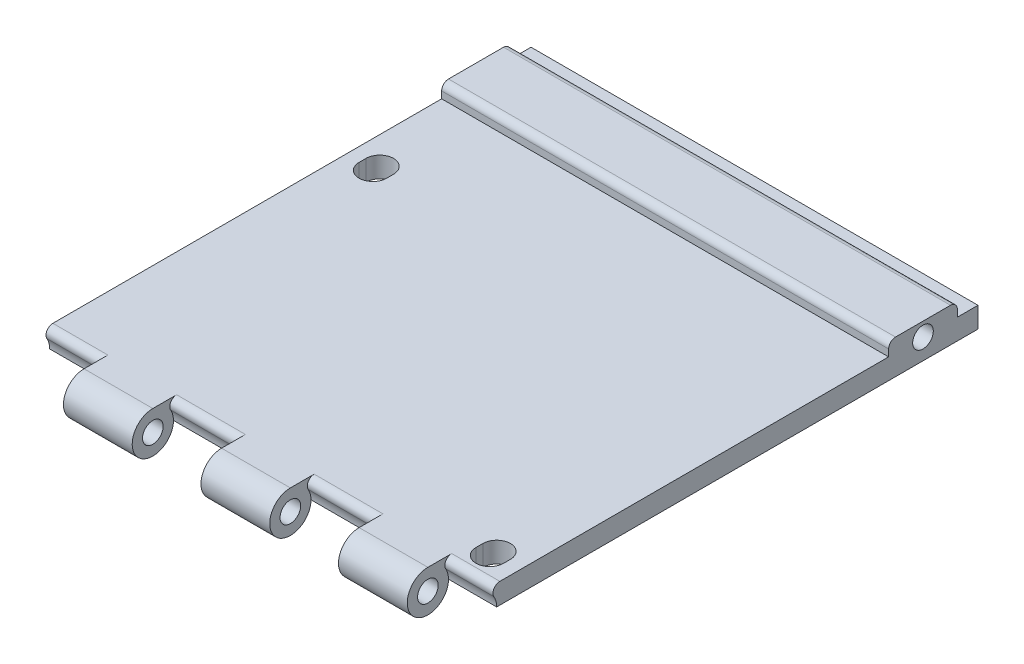
ISO-10303-21;
HEADER;
FILE_DESCRIPTION(('STEP AP214'),'2;1');
FILE_NAME('part.step','',(''),(''),'','','');
FILE_SCHEMA(('AUTOMOTIVE_DESIGN { 1 0 10303 214 1 1 1 1 }'));
ENDSEC;
DATA;
#1=APPLICATION_CONTEXT('core data for automotive mechanical design processes');
#2=APPLICATION_PROTOCOL_DEFINITION('international standard','automotive_design',2000,#1);
#3=PRODUCT_CONTEXT('',#1,'mechanical');
#4=PRODUCT('Part','Part','',(#3));
#5=PRODUCT_RELATED_PRODUCT_CATEGORY('part','',(#4));
#6=PRODUCT_DEFINITION_FORMATION('','',#4);
#7=PRODUCT_DEFINITION_CONTEXT('part definition',#1,'design');
#8=PRODUCT_DEFINITION('design','',#6,#7);
#9=PRODUCT_DEFINITION_SHAPE('','',#8);
#10=(LENGTH_UNIT() NAMED_UNIT(*) SI_UNIT(.MILLI.,.METRE.));
#11=(NAMED_UNIT(*) PLANE_ANGLE_UNIT() SI_UNIT($,.RADIAN.));
#12=(NAMED_UNIT(*) SI_UNIT($,.STERADIAN.) SOLID_ANGLE_UNIT());
#13=UNCERTAINTY_MEASURE_WITH_UNIT(LENGTH_MEASURE(1.E-05),#10,'distance_accuracy_value','');
#14=(GEOMETRIC_REPRESENTATION_CONTEXT(3) GLOBAL_UNCERTAINTY_ASSIGNED_CONTEXT((#13)) GLOBAL_UNIT_ASSIGNED_CONTEXT((#10,
#11,#12)) REPRESENTATION_CONTEXT('',''));
#15=CARTESIAN_POINT('',(0.,0.,0.));
#16=DIRECTION('',(0.,0.,1.));
#17=DIRECTION('',(1.,0.,0.));
#18=AXIS2_PLACEMENT_3D('',#15,#16,#17);
#19=CARTESIAN_POINT('',(0.,3.,0.));
#20=DIRECTION('',(0.,1.,0.));
#21=DIRECTION('',(0.,0.,1.));
#22=AXIS2_PLACEMENT_3D('',#19,#20,#21);
#23=PLANE('',#22);
#24=DIRECTION('',(-1.,0.,0.));
#25=VECTOR('',#24,1.);
#26=CARTESIAN_POINT('',(0.,3.,-33.5));
#27=LINE('',#26,#25);
#28=CARTESIAN_POINT('',(32.5,3.,-33.5));
#29=VERTEX_POINT('',#28);
#30=CARTESIAN_POINT('',(-32.5,3.,-33.5));
#31=VERTEX_POINT('',#30);
#32=EDGE_CURVE('E290',#29,#31,#27,.T.);
#33=ORIENTED_EDGE('',*,*,#32,.F.);
#34=DIRECTION('',(0.,0.,-1.));
#35=VECTOR('',#34,1.);
#36=CARTESIAN_POINT('',(32.5,3.,-36.5));
#37=LINE('',#36,#35);
#38=CARTESIAN_POINT('',(32.5,3.,-36.5));
#39=VERTEX_POINT('',#38);
#40=EDGE_CURVE('E382',#29,#39,#37,.T.);
#41=ORIENTED_EDGE('',*,*,#40,.T.);
#42=DIRECTION('',(-1.,0.,0.));
#43=VECTOR('',#42,1.);
#44=CARTESIAN_POINT('',(-32.5,3.,-36.5));
#45=LINE('',#44,#43);
#46=CARTESIAN_POINT('',(-32.5,3.,-36.5));
#47=VERTEX_POINT('',#46);
#48=EDGE_CURVE('E381',#39,#47,#45,.T.);
#49=ORIENTED_EDGE('',*,*,#48,.T.);
#50=DIRECTION('',(0.,0.,1.));
#51=VECTOR('',#50,1.);
#52=CARTESIAN_POINT('',(-32.5,3.,-36.5));
#53=LINE('',#52,#51);
#54=EDGE_CURVE('E385',#47,#31,#53,.T.);
#55=ORIENTED_EDGE('',*,*,#54,.T.);
#56=EDGE_LOOP('',(#33,#41,#49,#55));
#57=FACE_BOUND('',#56,.T.);
#58=ADVANCED_FACE('F35',(#57),#23,.T.);
#59=CARTESIAN_POINT('',(-32.5,0.,36.5));
#60=DIRECTION('',(1.,0.,0.));
#61=DIRECTION('',(0.,0.,-1.));
#62=AXIS2_PLACEMENT_3D('',#59,#60,#61);
#63=CYLINDRICAL_SURFACE('',#62,3.);
#64=DIRECTION('',(1.,0.,0.));
#65=VECTOR('',#64,1.);
#66=CARTESIAN_POINT('',(-32.5,0.,33.5));
#67=LINE('',#66,#65);
#68=CARTESIAN_POINT('',(25.5,0.,33.5));
#69=VERTEX_POINT('',#68);
#70=CARTESIAN_POINT('',(15.5,0.,33.5));
#71=VERTEX_POINT('',#70);
#72=EDGE_CURVE('E409',#69,#71,#67,.F.);
#73=ORIENTED_EDGE('',*,*,#72,.F.);
#74=CARTESIAN_POINT('',(25.5,0.,36.5));
#75=DIRECTION('',(1.,0.,0.));
#76=DIRECTION('',(0.,0.,-1.));
#77=AXIS2_PLACEMENT_3D('',#74,#75,#76);
#78=CIRCLE('',#77,3.);
#79=CARTESIAN_POINT('',(25.5,3.,36.5));
#80=VERTEX_POINT('',#79);
#81=EDGE_CURVE('E359',#80,#69,#78,.T.);
#82=ORIENTED_EDGE('',*,*,#81,.F.);
#83=DIRECTION('',(1.,0.,0.));
#84=VECTOR('',#83,1.);
#85=CARTESIAN_POINT('',(-32.5,3.,36.5));
#86=LINE('',#85,#84);
#87=CARTESIAN_POINT('',(15.5,3.,36.5));
#88=VERTEX_POINT('',#87);
#89=EDGE_CURVE('E388',#88,#80,#86,.T.);
#90=ORIENTED_EDGE('',*,*,#89,.F.);
#91=CARTESIAN_POINT('',(15.5,0.,36.5));
#92=DIRECTION('',(-1.,0.,0.));
#93=DIRECTION('',(0.,0.,1.));
#94=AXIS2_PLACEMENT_3D('',#91,#92,#93);
#95=CIRCLE('',#94,2.99999999999999);
#96=EDGE_CURVE('E358',#71,#88,#95,.T.);
#97=ORIENTED_EDGE('',*,*,#96,.F.);
#98=EDGE_LOOP('',(#73,#82,#90,#97));
#99=FACE_BOUND('',#98,.T.);
#100=ADVANCED_FACE('F574',(#99),#63,.T.);
#101=CARTESIAN_POINT('',(5.5,0.,36.5));
#102=DIRECTION('',(-1.,0.,0.));
#103=DIRECTION('',(0.,0.,1.));
#104=AXIS2_PLACEMENT_3D('',#101,#102,#103);
#105=CIRCLE('',#104,2.99999999999999);
#106=CARTESIAN_POINT('',(5.50000000000001,0.,33.5));
#107=VERTEX_POINT('',#106);
#108=CARTESIAN_POINT('',(5.5,3.,36.5));
#109=VERTEX_POINT('',#108);
#110=EDGE_CURVE('E365',#107,#109,#105,.T.);
#111=ORIENTED_EDGE('',*,*,#110,.T.);
#112=CARTESIAN_POINT('',(-4.5,3.,36.5));
#113=VERTEX_POINT('',#112);
#114=EDGE_CURVE('E391',#113,#109,#86,.T.);
#115=ORIENTED_EDGE('',*,*,#114,.F.);
#116=CARTESIAN_POINT('',(-4.5,0.,36.5));
#117=DIRECTION('',(-1.,0.,0.));
#118=DIRECTION('',(0.,0.,1.));
#119=AXIS2_PLACEMENT_3D('',#116,#117,#118);
#120=CIRCLE('',#119,2.99999999999999);
#121=CARTESIAN_POINT('',(-4.5,0.,33.5));
#122=VERTEX_POINT('',#121);
#123=EDGE_CURVE('E364',#122,#113,#120,.T.);
#124=ORIENTED_EDGE('',*,*,#123,.F.);
#125=EDGE_CURVE('E520',#107,#122,#67,.F.);
#126=ORIENTED_EDGE('',*,*,#125,.F.);
#127=EDGE_LOOP('',(#111,#115,#124,#126));
#128=FACE_BOUND('',#127,.T.);
#129=ADVANCED_FACE('F585',(#128),#63,.T.);
#130=CARTESIAN_POINT('',(-14.5,0.,36.5));
#131=DIRECTION('',(-1.,0.,0.));
#132=DIRECTION('',(0.,0.,1.));
#133=AXIS2_PLACEMENT_3D('',#130,#131,#132);
#134=CIRCLE('',#133,2.99999999999999);
#135=CARTESIAN_POINT('',(-14.5,0.,33.5));
#136=VERTEX_POINT('',#135);
#137=CARTESIAN_POINT('',(-14.5,3.,36.5));
#138=VERTEX_POINT('',#137);
#139=EDGE_CURVE('E371',#136,#138,#134,.T.);
#140=ORIENTED_EDGE('',*,*,#139,.T.);
#141=CARTESIAN_POINT('',(-24.5,2.99999999999999,36.5));
#142=VERTEX_POINT('',#141);
#143=EDGE_CURVE('E392',#142,#138,#86,.T.);
#144=ORIENTED_EDGE('',*,*,#143,.F.);
#145=CARTESIAN_POINT('',(-24.5,0.,36.5));
#146=DIRECTION('',(-1.,0.,0.));
#147=DIRECTION('',(0.,0.,1.));
#148=AXIS2_PLACEMENT_3D('',#145,#146,#147);
#149=CIRCLE('',#148,3.);
#150=CARTESIAN_POINT('',(-24.5,0.,33.5));
#151=VERTEX_POINT('',#150);
#152=EDGE_CURVE('E408',#142,#151,#149,.F.);
#153=ORIENTED_EDGE('',*,*,#152,.T.);
#154=EDGE_CURVE('E511',#136,#151,#67,.F.);
#155=ORIENTED_EDGE('',*,*,#154,.F.);
#156=EDGE_LOOP('',(#140,#144,#153,#155));
#157=FACE_BOUND('',#156,.T.);
#158=ADVANCED_FACE('F509',(#157),#63,.T.);
#159=CARTESIAN_POINT('',(32.5,3.,-36.5));
#160=DIRECTION('',(-1.,0.,0.));
#161=DIRECTION('',(0.,0.,1.));
#162=AXIS2_PLACEMENT_3D('',#159,#160,#161);
#163=PLANE('',#162);
#164=DIRECTION('',(0.,0.,-1.));
#165=VECTOR('',#164,1.);
#166=CARTESIAN_POINT('',(32.5,5.,-32.5));
#167=LINE('',#166,#165);
#168=CARTESIAN_POINT('',(32.5,5.,-24.5));
#169=VERTEX_POINT('',#168);
#170=CARTESIAN_POINT('',(32.5,5.,-32.5));
#171=VERTEX_POINT('',#170);
#172=EDGE_CURVE('E264',#169,#171,#167,.T.);
#173=ORIENTED_EDGE('',*,*,#172,.F.);
#174=CARTESIAN_POINT('',(32.5,4.,-24.5));
#175=DIRECTION('',(-1.,0.,0.));
#176=DIRECTION('',(0.,0.,-1.));
#177=AXIS2_PLACEMENT_3D('',#174,#175,#176);
#178=CIRCLE('',#177,1.);
#179=CARTESIAN_POINT('',(32.5,3.99999999999999,-23.5));
#180=VERTEX_POINT('',#179);
#181=EDGE_CURVE('E250',#180,#169,#178,.T.);
#182=ORIENTED_EDGE('',*,*,#181,.F.);
#183=DIRECTION('',(0.,1.,0.));
#184=VECTOR('',#183,1.);
#185=CARTESIAN_POINT('',(32.5,0.,-23.5));
#186=LINE('',#185,#184);
#187=CARTESIAN_POINT('',(32.5,3.,-23.5));
#188=VERTEX_POINT('',#187);
#189=EDGE_CURVE('E239',#188,#180,#186,.T.);
#190=ORIENTED_EDGE('',*,*,#189,.F.);
#191=CARTESIAN_POINT('',(32.5,3.,33.0358983848623));
#192=VERTEX_POINT('',#191);
#193=EDGE_CURVE('E379',#192,#188,#37,.T.);
#194=ORIENTED_EDGE('',*,*,#193,.F.);
#195=CARTESIAN_POINT('',(32.5,2.,33.0358983848623));
#196=DIRECTION('',(-1.,0.,0.));
#197=DIRECTION('',(0.,0.,1.));
#198=AXIS2_PLACEMENT_3D('',#195,#196,#197);
#199=CIRCLE('',#198,1.);
#200=CARTESIAN_POINT('',(32.5,1.5,33.9019237886467));
#201=VERTEX_POINT('',#200);
#202=EDGE_CURVE('E460',#192,#201,#199,.F.);
#203=ORIENTED_EDGE('',*,*,#202,.T.);
#204=CARTESIAN_POINT('',(32.5,0.,36.5));
#205=DIRECTION('',(1.,0.,0.));
#206=DIRECTION('',(0.,0.,-1.));
#207=AXIS2_PLACEMENT_3D('',#204,#205,#206);
#208=CIRCLE('',#207,3.);
#209=CARTESIAN_POINT('',(32.5,0.,33.5));
#210=VERTEX_POINT('',#209);
#211=EDGE_CURVE('E330',#210,#201,#208,.T.);
#212=ORIENTED_EDGE('',*,*,#211,.F.);
#213=DIRECTION('',(0.,0.,-1.));
#214=VECTOR('',#213,1.);
#215=CARTESIAN_POINT('',(32.5,0.,-36.5));
#216=LINE('',#215,#214);
#217=CARTESIAN_POINT('',(32.5,0.,-36.5));
#218=VERTEX_POINT('',#217);
#219=EDGE_CURVE('E377',#210,#218,#216,.T.);
#220=ORIENTED_EDGE('',*,*,#219,.T.);
#221=DIRECTION('',(0.,-1.,0.));
#222=VECTOR('',#221,1.);
#223=CARTESIAN_POINT('',(32.5,3.,-36.5));
#224=LINE('',#223,#222);
#225=EDGE_CURVE('E401',#39,#218,#224,.T.);
#226=ORIENTED_EDGE('',*,*,#225,.F.);
#227=ORIENTED_EDGE('',*,*,#40,.F.);
#228=DIRECTION('',(0.,-1.,0.));
#229=VECTOR('',#228,1.);
#230=CARTESIAN_POINT('',(32.5,0.,-33.5));
#231=LINE('',#230,#229);
#232=CARTESIAN_POINT('',(32.5,3.99999999999999,-33.5));
#233=VERTEX_POINT('',#232);
#234=EDGE_CURVE('E251',#233,#29,#231,.T.);
#235=ORIENTED_EDGE('',*,*,#234,.F.);
#236=CARTESIAN_POINT('',(32.5,4.,-32.5));
#237=DIRECTION('',(-1.,0.,0.));
#238=DIRECTION('',(0.,0.,-1.));
#239=AXIS2_PLACEMENT_3D('',#236,#237,#238);
#240=CIRCLE('',#239,1.);
#241=EDGE_CURVE('E259',#171,#233,#240,.T.);
#242=ORIENTED_EDGE('',*,*,#241,.F.);
#243=EDGE_LOOP('',(#173,#182,#190,#194,#203,#212,#220,#226,#227,#235,#242));
#244=FACE_BOUND('',#243,.T.);
#245=CARTESIAN_POINT('',(32.5,3.,-28.5));
#246=DIRECTION('',(-1.,0.,0.));
#247=DIRECTION('',(0.,0.,1.));
#248=AXIS2_PLACEMENT_3D('',#245,#246,#247);
#249=CIRCLE('',#248,1.5);
#250=CARTESIAN_POINT('',(32.5,3.,-27.));
#251=VERTEX_POINT('',#250);
#252=EDGE_CURVE('E293',#251,#251,#249,.T.);
#253=ORIENTED_EDGE('',*,*,#252,.T.);
#254=EDGE_LOOP('',(#253));
#255=FACE_BOUND('',#254,.T.);
#256=ADVANCED_FACE('F261',(#244,#255),#163,.F.);
#257=CARTESIAN_POINT('',(-32.5,3.,-36.5));
#258=DIRECTION('',(0.,0.,1.));
#259=DIRECTION('',(1.,0.,0.));
#260=AXIS2_PLACEMENT_3D('',#257,#258,#259);
#261=PLANE('',#260);
#262=DIRECTION('',(-1.,0.,0.));
#263=VECTOR('',#262,1.);
#264=CARTESIAN_POINT('',(-32.5,0.,-36.5));
#265=LINE('',#264,#263);
#266=CARTESIAN_POINT('',(-32.5,0.,-36.5));
#267=VERTEX_POINT('',#266);
#268=EDGE_CURVE('E394',#218,#267,#265,.T.);
#269=ORIENTED_EDGE('',*,*,#268,.T.);
#270=DIRECTION('',(0.,-1.,0.));
#271=VECTOR('',#270,1.);
#272=CARTESIAN_POINT('',(-32.5,3.,-36.5));
#273=LINE('',#272,#271);
#274=EDGE_CURVE('E398',#47,#267,#273,.T.);
#275=ORIENTED_EDGE('',*,*,#274,.F.);
#276=ORIENTED_EDGE('',*,*,#48,.F.);
#277=ORIENTED_EDGE('',*,*,#225,.T.);
#278=EDGE_LOOP('',(#269,#275,#276,#277));
#279=FACE_BOUND('',#278,.T.);
#280=ADVANCED_FACE('F554',(#279),#261,.F.);
#281=CARTESIAN_POINT('',(-32.5,3.,-36.5));
#282=DIRECTION('',(1.,0.,0.));
#283=DIRECTION('',(0.,0.,-1.));
#284=AXIS2_PLACEMENT_3D('',#281,#282,#283);
#285=PLANE('',#284);
#286=DIRECTION('',(0.,0.,-1.));
#287=VECTOR('',#286,1.);
#288=CARTESIAN_POINT('',(-32.5,5.,-32.5));
#289=LINE('',#288,#287);
#290=CARTESIAN_POINT('',(-32.5,5.,-24.5));
#291=VERTEX_POINT('',#290);
#292=CARTESIAN_POINT('',(-32.5,5.,-32.5));
#293=VERTEX_POINT('',#292);
#294=EDGE_CURVE('E278',#291,#293,#289,.T.);
#295=ORIENTED_EDGE('',*,*,#294,.T.);
#296=CARTESIAN_POINT('',(-32.5,4.,-32.5));
#297=DIRECTION('',(-1.,0.,0.));
#298=DIRECTION('',(0.,0.,-1.));
#299=AXIS2_PLACEMENT_3D('',#296,#297,#298);
#300=CIRCLE('',#299,1.);
#301=CARTESIAN_POINT('',(-32.5,3.99999999999999,-33.5));
#302=VERTEX_POINT('',#301);
#303=EDGE_CURVE('E280',#293,#302,#300,.T.);
#304=ORIENTED_EDGE('',*,*,#303,.T.);
#305=DIRECTION('',(0.,-1.,0.));
#306=VECTOR('',#305,1.);
#307=CARTESIAN_POINT('',(-32.5,0.,-33.5));
#308=LINE('',#307,#306);
#309=EDGE_CURVE('E272',#302,#31,#308,.T.);
#310=ORIENTED_EDGE('',*,*,#309,.T.);
#311=ORIENTED_EDGE('',*,*,#54,.F.);
#312=ORIENTED_EDGE('',*,*,#274,.T.);
#313=DIRECTION('',(0.,0.,1.));
#314=VECTOR('',#313,1.);
#315=CARTESIAN_POINT('',(-32.5,0.,-36.5));
#316=LINE('',#315,#314);
#317=CARTESIAN_POINT('',(-32.5,0.,33.5));
#318=VERTEX_POINT('',#317);
#319=EDGE_CURVE('E396',#267,#318,#316,.T.);
#320=ORIENTED_EDGE('',*,*,#319,.T.);
#321=CARTESIAN_POINT('',(-32.5,0.,36.5));
#322=DIRECTION('',(-1.,0.,0.));
#323=DIRECTION('',(0.,0.,1.));
#324=AXIS2_PLACEMENT_3D('',#321,#322,#323);
#325=CIRCLE('',#324,2.99999999999999);
#326=CARTESIAN_POINT('',(-32.5,1.5,33.9019237886467));
#327=VERTEX_POINT('',#326);
#328=EDGE_CURVE('E374',#327,#318,#325,.T.);
#329=ORIENTED_EDGE('',*,*,#328,.F.);
#330=CARTESIAN_POINT('',(-32.5,2.,33.0358983848623));
#331=DIRECTION('',(1.,0.,0.));
#332=DIRECTION('',(0.,0.,-1.));
#333=AXIS2_PLACEMENT_3D('',#330,#331,#332);
#334=CIRCLE('',#333,1.);
#335=CARTESIAN_POINT('',(-32.5,3.,33.0358983848623));
#336=VERTEX_POINT('',#335);
#337=EDGE_CURVE('E472',#327,#336,#334,.F.);
#338=ORIENTED_EDGE('',*,*,#337,.T.);
#339=CARTESIAN_POINT('',(-32.5,3.,-23.5));
#340=VERTEX_POINT('',#339);
#341=EDGE_CURVE('E384',#340,#336,#53,.T.);
#342=ORIENTED_EDGE('',*,*,#341,.F.);
#343=DIRECTION('',(0.,1.,0.));
#344=VECTOR('',#343,1.);
#345=CARTESIAN_POINT('',(-32.5,0.,-23.5));
#346=LINE('',#345,#344);
#347=CARTESIAN_POINT('',(-32.5,3.99999999999999,-23.5));
#348=VERTEX_POINT('',#347);
#349=EDGE_CURVE('E275',#340,#348,#346,.T.);
#350=ORIENTED_EDGE('',*,*,#349,.T.);
#351=CARTESIAN_POINT('',(-32.5,4.,-24.5));
#352=DIRECTION('',(-1.,0.,0.));
#353=DIRECTION('',(0.,0.,-1.));
#354=AXIS2_PLACEMENT_3D('',#351,#352,#353);
#355=CIRCLE('',#354,1.);
#356=EDGE_CURVE('E257',#348,#291,#355,.T.);
#357=ORIENTED_EDGE('',*,*,#356,.T.);
#358=EDGE_LOOP('',(#295,#304,#310,#311,#312,#320,#329,#338,#342,#350,#357));
#359=FACE_BOUND('',#358,.T.);
#360=CARTESIAN_POINT('',(-32.5,3.,-28.5));
#361=DIRECTION('',(-1.,0.,0.));
#362=DIRECTION('',(0.,0.,1.));
#363=AXIS2_PLACEMENT_3D('',#360,#361,#362);
#364=CIRCLE('',#363,1.5);
#365=CARTESIAN_POINT('',(-32.5,3.,-27.));
#366=VERTEX_POINT('',#365);
#367=EDGE_CURVE('E292',#366,#366,#364,.T.);
#368=ORIENTED_EDGE('',*,*,#367,.F.);
#369=EDGE_LOOP('',(#368));
#370=FACE_BOUND('',#369,.T.);
#371=ADVANCED_FACE('F530',(#359,#370),#285,.F.);
#372=DIRECTION('',(1.,0.,0.));
#373=VECTOR('',#372,1.);
#374=CARTESIAN_POINT('',(0.,3.,-23.5));
#375=LINE('',#374,#373);
#376=EDGE_CURVE('E245',#340,#188,#375,.T.);
#377=ORIENTED_EDGE('',*,*,#376,.F.);
#378=ORIENTED_EDGE('',*,*,#341,.T.);
#379=DIRECTION('',(1.,0.,0.));
#380=VECTOR('',#379,1.);
#381=CARTESIAN_POINT('',(0.,3.,33.0358983848623));
#382=LINE('',#381,#380);
#383=CARTESIAN_POINT('',(-24.5,3.,33.0358983848623));
#384=VERTEX_POINT('',#383);
#385=EDGE_CURVE('E439',#336,#384,#382,.T.);
#386=ORIENTED_EDGE('',*,*,#385,.T.);
#387=DIRECTION('',(0.,0.,1.));
#388=VECTOR('',#387,1.);
#389=CARTESIAN_POINT('',(-24.5,3.,0.));
#390=LINE('',#389,#388);
#391=EDGE_CURVE('E435',#384,#142,#390,.T.);
#392=ORIENTED_EDGE('',*,*,#391,.T.);
#393=ORIENTED_EDGE('',*,*,#143,.T.);
#394=DIRECTION('',(0.,0.,-1.));
#395=VECTOR('',#394,1.);
#396=CARTESIAN_POINT('',(-14.5,3.,36.5));
#397=LINE('',#396,#395);
#398=CARTESIAN_POINT('',(-14.5,3.,33.0358983848623));
#399=VERTEX_POINT('',#398);
#400=EDGE_CURVE('E50',#138,#399,#397,.T.);
#401=ORIENTED_EDGE('',*,*,#400,.T.);
#402=DIRECTION('',(1.,0.,0.));
#403=VECTOR('',#402,1.);
#404=CARTESIAN_POINT('',(0.,3.,33.0358983848623));
#405=LINE('',#404,#403);
#406=CARTESIAN_POINT('',(-4.5,3.,33.0358983848623));
#407=VERTEX_POINT('',#406);
#408=EDGE_CURVE('E444',#399,#407,#405,.T.);
#409=ORIENTED_EDGE('',*,*,#408,.T.);
#410=DIRECTION('',(0.,0.,1.));
#411=VECTOR('',#410,1.);
#412=CARTESIAN_POINT('',(-4.5,3.,0.));
#413=LINE('',#412,#411);
#414=EDGE_CURVE('E442',#407,#113,#413,.T.);
#415=ORIENTED_EDGE('',*,*,#414,.T.);
#416=ORIENTED_EDGE('',*,*,#114,.T.);
#417=DIRECTION('',(0.,0.,-1.));
#418=VECTOR('',#417,1.);
#419=CARTESIAN_POINT('',(5.5,3.,36.5));
#420=LINE('',#419,#418);
#421=CARTESIAN_POINT('',(5.5,3.,33.0358983848623));
#422=VERTEX_POINT('',#421);
#423=EDGE_CURVE('E58',#109,#422,#420,.T.);
#424=ORIENTED_EDGE('',*,*,#423,.T.);
#425=DIRECTION('',(1.,0.,0.));
#426=VECTOR('',#425,1.);
#427=CARTESIAN_POINT('',(0.,3.,33.0358983848623));
#428=LINE('',#427,#426);
#429=CARTESIAN_POINT('',(15.5,3.,33.0358983848623));
#430=VERTEX_POINT('',#429);
#431=EDGE_CURVE('E450',#422,#430,#428,.T.);
#432=ORIENTED_EDGE('',*,*,#431,.T.);
#433=DIRECTION('',(0.,0.,1.));
#434=VECTOR('',#433,1.);
#435=CARTESIAN_POINT('',(15.5,3.,0.));
#436=LINE('',#435,#434);
#437=EDGE_CURVE('E448',#430,#88,#436,.T.);
#438=ORIENTED_EDGE('',*,*,#437,.T.);
#439=ORIENTED_EDGE('',*,*,#89,.T.);
#440=DIRECTION('',(0.,0.,-1.));
#441=VECTOR('',#440,1.);
#442=CARTESIAN_POINT('',(25.5,3.,0.));
#443=LINE('',#442,#441);
#444=CARTESIAN_POINT('',(25.5,3.,33.0358983848623));
#445=VERTEX_POINT('',#444);
#446=EDGE_CURVE('E454',#80,#445,#443,.T.);
#447=ORIENTED_EDGE('',*,*,#446,.T.);
#448=DIRECTION('',(-1.,0.,0.));
#449=VECTOR('',#448,1.);
#450=CARTESIAN_POINT('',(32.5,3.,33.0358983848623));
#451=LINE('',#450,#449);
#452=EDGE_CURVE('E457',#445,#192,#451,.F.);
#453=ORIENTED_EDGE('',*,*,#452,.T.);
#454=ORIENTED_EDGE('',*,*,#193,.T.);
#455=EDGE_LOOP('',(#377,#378,#386,#392,#393,#401,#409,#415,#416,#424,#432,#438,#439,#447,#453,#454));
#456=FACE_BOUND('',#455,.T.);
#457=DIRECTION('',(0.,0.,1.));
#458=VECTOR('',#457,1.);
#459=CARTESIAN_POINT('',(-30.5,3.,0.));
#460=LINE('',#459,#458);
#461=CARTESIAN_POINT('',(-30.5,3.,-10.5));
#462=VERTEX_POINT('',#461);
#463=CARTESIAN_POINT('',(-30.5,3.,-9.5));
#464=VERTEX_POINT('',#463);
#465=EDGE_CURVE('E315',#462,#464,#460,.T.);
#466=ORIENTED_EDGE('',*,*,#465,.F.);
#467=CARTESIAN_POINT('',(-28.5,3.,-10.5));
#468=DIRECTION('',(0.,1.,0.));
#469=DIRECTION('',(0.,0.,1.));
#470=AXIS2_PLACEMENT_3D('',#467,#468,#469);
#471=CIRCLE('',#470,2.);
#472=CARTESIAN_POINT('',(-26.5,3.,-10.5));
#473=VERTEX_POINT('',#472);
#474=EDGE_CURVE('E324',#473,#462,#471,.T.);
#475=ORIENTED_EDGE('',*,*,#474,.F.);
#476=DIRECTION('',(0.,0.,1.));
#477=VECTOR('',#476,1.);
#478=CARTESIAN_POINT('',(-26.5,3.,0.));
#479=LINE('',#478,#477);
#480=CARTESIAN_POINT('',(-26.5,3.,-9.5));
#481=VERTEX_POINT('',#480);
#482=EDGE_CURVE('E321',#473,#481,#479,.T.);
#483=ORIENTED_EDGE('',*,*,#482,.T.);
#484=CARTESIAN_POINT('',(-28.5,3.,-9.5));
#485=DIRECTION('',(0.,1.,0.));
#486=DIRECTION('',(0.,0.,1.));
#487=AXIS2_PLACEMENT_3D('',#484,#485,#486);
#488=CIRCLE('',#487,2.);
#489=EDGE_CURVE('E317',#464,#481,#488,.T.);
#490=ORIENTED_EDGE('',*,*,#489,.F.);
#491=EDGE_LOOP('',(#466,#475,#483,#490));
#492=FACE_BOUND('',#491,.T.);
#493=CARTESIAN_POINT('',(28.5,3.,29.5));
#494=DIRECTION('',(0.,1.,0.));
#495=DIRECTION('',(0.,0.,1.));
#496=AXIS2_PLACEMENT_3D('',#493,#494,#495);
#497=CIRCLE('',#496,1.99999999999999);
#498=CARTESIAN_POINT('',(30.5,3.,29.5));
#499=VERTEX_POINT('',#498);
#500=CARTESIAN_POINT('',(26.5,3.,29.5));
#501=VERTEX_POINT('',#500);
#502=EDGE_CURVE('E318',#499,#501,#497,.T.);
#503=ORIENTED_EDGE('',*,*,#502,.F.);
#504=DIRECTION('',(0.,0.,1.));
#505=VECTOR('',#504,1.);
#506=CARTESIAN_POINT('',(30.5,3.,29.5));
#507=LINE('',#506,#505);
#508=CARTESIAN_POINT('',(30.5,3.,30.5));
#509=VERTEX_POINT('',#508);
#510=EDGE_CURVE('E340',#499,#509,#507,.T.);
#511=ORIENTED_EDGE('',*,*,#510,.T.);
#512=CARTESIAN_POINT('',(28.5,3.,30.5));
#513=DIRECTION('',(0.,1.,0.));
#514=DIRECTION('',(0.,0.,1.));
#515=AXIS2_PLACEMENT_3D('',#512,#513,#514);
#516=CIRCLE('',#515,1.99999999999999);
#517=CARTESIAN_POINT('',(26.5,3.,30.5));
#518=VERTEX_POINT('',#517);
#519=EDGE_CURVE('E348',#518,#509,#516,.T.);
#520=ORIENTED_EDGE('',*,*,#519,.F.);
#521=DIRECTION('',(0.,0.,1.));
#522=VECTOR('',#521,1.);
#523=CARTESIAN_POINT('',(26.5,3.,29.5));
#524=LINE('',#523,#522);
#525=EDGE_CURVE('E351',#501,#518,#524,.T.);
#526=ORIENTED_EDGE('',*,*,#525,.F.);
#527=EDGE_LOOP('',(#503,#511,#520,#526));
#528=FACE_BOUND('',#527,.T.);
#529=ADVANCED_FACE('F501',(#456,#492,#528),#23,.T.);
#530=CARTESIAN_POINT('',(0.,0.,0.));
#531=DIRECTION('',(0.,1.,0.));
#532=DIRECTION('',(0.,0.,1.));
#533=AXIS2_PLACEMENT_3D('',#530,#531,#532);
#534=PLANE('',#533);
#535=EDGE_CURVE('E404',#151,#318,#67,.F.);
#536=ORIENTED_EDGE('',*,*,#535,.T.);
#537=ORIENTED_EDGE('',*,*,#319,.F.);
#538=ORIENTED_EDGE('',*,*,#268,.F.);
#539=ORIENTED_EDGE('',*,*,#219,.F.);
#540=EDGE_CURVE('E405',#210,#69,#67,.F.);
#541=ORIENTED_EDGE('',*,*,#540,.T.);
#542=ORIENTED_EDGE('',*,*,#72,.T.);
#543=EDGE_CURVE('E515',#71,#107,#67,.F.);
#544=ORIENTED_EDGE('',*,*,#543,.T.);
#545=ORIENTED_EDGE('',*,*,#125,.T.);
#546=EDGE_CURVE('E496',#122,#136,#67,.F.);
#547=ORIENTED_EDGE('',*,*,#546,.T.);
#548=ORIENTED_EDGE('',*,*,#154,.T.);
#549=EDGE_LOOP('',(#536,#537,#538,#539,#541,#542,#544,#545,#547,#548));
#550=FACE_BOUND('',#549,.T.);
#551=DIRECTION('',(0.,0.,1.));
#552=VECTOR('',#551,1.);
#553=CARTESIAN_POINT('',(30.5,0.,0.));
#554=LINE('',#553,#552);
#555=CARTESIAN_POINT('',(30.5,0.,29.5));
#556=VERTEX_POINT('',#555);
#557=CARTESIAN_POINT('',(30.5,0.,30.5));
#558=VERTEX_POINT('',#557);
#559=EDGE_CURVE('E418',#556,#558,#554,.T.);
#560=ORIENTED_EDGE('',*,*,#559,.F.);
#561=CARTESIAN_POINT('',(28.5,0.,29.5));
#562=DIRECTION('',(0.,1.,0.));
#563=DIRECTION('',(0.,0.,1.));
#564=AXIS2_PLACEMENT_3D('',#561,#562,#563);
#565=CIRCLE('',#564,1.99999999999999);
#566=CARTESIAN_POINT('',(26.5,0.,29.5));
#567=VERTEX_POINT('',#566);
#568=EDGE_CURVE('E420',#556,#567,#565,.T.);
#569=ORIENTED_EDGE('',*,*,#568,.T.);
#570=DIRECTION('',(0.,0.,1.));
#571=VECTOR('',#570,1.);
#572=CARTESIAN_POINT('',(26.5,0.,0.));
#573=LINE('',#572,#571);
#574=CARTESIAN_POINT('',(26.5,0.,30.5));
#575=VERTEX_POINT('',#574);
#576=EDGE_CURVE('E412',#567,#575,#573,.T.);
#577=ORIENTED_EDGE('',*,*,#576,.T.);
#578=CARTESIAN_POINT('',(28.5,0.,30.5));
#579=DIRECTION('',(0.,1.,0.));
#580=DIRECTION('',(0.,0.,1.));
#581=AXIS2_PLACEMENT_3D('',#578,#579,#580);
#582=CIRCLE('',#581,1.99999999999999);
#583=EDGE_CURVE('E415',#575,#558,#582,.T.);
#584=ORIENTED_EDGE('',*,*,#583,.T.);
#585=EDGE_LOOP('',(#560,#569,#577,#584));
#586=FACE_BOUND('',#585,.T.);
#587=CARTESIAN_POINT('',(-28.5,0.,-10.5));
#588=DIRECTION('',(0.,1.,0.));
#589=DIRECTION('',(0.,0.,1.));
#590=AXIS2_PLACEMENT_3D('',#587,#588,#589);
#591=CIRCLE('',#590,2.);
#592=CARTESIAN_POINT('',(-26.5,0.,-10.5));
#593=VERTEX_POINT('',#592);
#594=CARTESIAN_POINT('',(-30.5,0.,-10.5));
#595=VERTEX_POINT('',#594);
#596=EDGE_CURVE('E429',#593,#595,#591,.T.);
#597=ORIENTED_EDGE('',*,*,#596,.T.);
#598=DIRECTION('',(0.,0.,1.));
#599=VECTOR('',#598,1.);
#600=CARTESIAN_POINT('',(-30.5,0.,0.));
#601=LINE('',#600,#599);
#602=CARTESIAN_POINT('',(-30.5,0.,-9.5));
#603=VERTEX_POINT('',#602);
#604=EDGE_CURVE('E432',#595,#603,#601,.T.);
#605=ORIENTED_EDGE('',*,*,#604,.T.);
#606=CARTESIAN_POINT('',(-28.5,0.,-9.5));
#607=DIRECTION('',(0.,1.,0.));
#608=DIRECTION('',(0.,0.,1.));
#609=AXIS2_PLACEMENT_3D('',#606,#607,#608);
#610=CIRCLE('',#609,2.);
#611=CARTESIAN_POINT('',(-26.5,0.,-9.5));
#612=VERTEX_POINT('',#611);
#613=EDGE_CURVE('E423',#603,#612,#610,.T.);
#614=ORIENTED_EDGE('',*,*,#613,.T.);
#615=DIRECTION('',(0.,0.,1.));
#616=VECTOR('',#615,1.);
#617=CARTESIAN_POINT('',(-26.5,0.,0.));
#618=LINE('',#617,#616);
#619=EDGE_CURVE('E426',#593,#612,#618,.T.);
#620=ORIENTED_EDGE('',*,*,#619,.F.);
#621=EDGE_LOOP('',(#597,#605,#614,#620));
#622=FACE_BOUND('',#621,.T.);
#623=ADVANCED_FACE('F516',(#550,#586,#622),#534,.F.);
#624=CARTESIAN_POINT('',(-32.5,0.,36.5));
#625=DIRECTION('',(1.,0.,0.));
#626=DIRECTION('',(0.,0.,-1.));
#627=AXIS2_PLACEMENT_3D('',#624,#625,#626);
#628=CYLINDRICAL_SURFACE('',#627,2.99999999999999);
#629=CARTESIAN_POINT('',(-24.5,0.,36.5));
#630=DIRECTION('',(-1.,0.,0.));
#631=DIRECTION('',(0.,0.,1.));
#632=AXIS2_PLACEMENT_3D('',#629,#630,#631);
#633=CIRCLE('',#632,2.99999999999999);
#634=CARTESIAN_POINT('',(-24.5,1.5,33.9019237886467));
#635=VERTEX_POINT('',#634);
#636=EDGE_CURVE('E370',#635,#151,#633,.T.);
#637=ORIENTED_EDGE('',*,*,#636,.F.);
#638=DIRECTION('',(1.,0.,0.));
#639=VECTOR('',#638,1.);
#640=CARTESIAN_POINT('',(-32.5,1.5,33.9019237886467));
#641=LINE('',#640,#639);
#642=EDGE_CURVE('E470',#635,#327,#641,.F.);
#643=ORIENTED_EDGE('',*,*,#642,.T.);
#644=ORIENTED_EDGE('',*,*,#328,.T.);
#645=ORIENTED_EDGE('',*,*,#535,.F.);
#646=EDGE_LOOP('',(#637,#643,#644,#645));
#647=FACE_BOUND('',#646,.T.);
#648=ADVANCED_FACE('F525',(#647),#628,.F.);
#649=CARTESIAN_POINT('',(-24.5,0.,36.5));
#650=DIRECTION('',(-1.,0.,0.));
#651=DIRECTION('',(0.,0.,1.));
#652=AXIS2_PLACEMENT_3D('',#649,#650,#651);
#653=PLANE('',#652);
#654=CARTESIAN_POINT('',(-24.5,0.,36.5));
#655=DIRECTION('',(-1.,0.,0.));
#656=DIRECTION('',(0.,0.,1.));
#657=AXIS2_PLACEMENT_3D('',#654,#655,#656);
#658=CIRCLE('',#657,1.5);
#659=CARTESIAN_POINT('',(-24.5,0.,38.));
#660=VERTEX_POINT('',#659);
#661=EDGE_CURVE('E311',#660,#660,#658,.T.);
#662=ORIENTED_EDGE('',*,*,#661,.F.);
#663=EDGE_LOOP('',(#662));
#664=FACE_BOUND('',#663,.T.);
#665=ORIENTED_EDGE('',*,*,#152,.F.);
#666=ORIENTED_EDGE('',*,*,#391,.F.);
#667=CARTESIAN_POINT('',(-24.5,2.,33.0358983848623));
#668=DIRECTION('',(-1.,0.,0.));
#669=DIRECTION('',(0.,0.,1.));
#670=AXIS2_PLACEMENT_3D('',#667,#668,#669);
#671=CIRCLE('',#670,1.);
#672=EDGE_CURVE('E11',#384,#635,#671,.F.);
#673=ORIENTED_EDGE('',*,*,#672,.T.);
#674=ORIENTED_EDGE('',*,*,#636,.T.);
#675=EDGE_LOOP('',(#665,#666,#673,#674));
#676=FACE_BOUND('',#675,.T.);
#677=ADVANCED_FACE('F943',(#664,#676),#653,.T.);
#678=CARTESIAN_POINT('',(-14.5,0.,36.5));
#679=DIRECTION('',(1.,0.,0.));
#680=DIRECTION('',(0.,0.,-1.));
#681=AXIS2_PLACEMENT_3D('',#678,#679,#680);
#682=CYLINDRICAL_SURFACE('',#681,2.99999999999999);
#683=CARTESIAN_POINT('',(-4.5,1.5,33.9019237886467));
#684=VERTEX_POINT('',#683);
#685=EDGE_CURVE('E372',#684,#122,#120,.T.);
#686=ORIENTED_EDGE('',*,*,#685,.F.);
#687=DIRECTION('',(1.,0.,0.));
#688=VECTOR('',#687,1.);
#689=CARTESIAN_POINT('',(-14.5,1.5,33.9019237886467));
#690=LINE('',#689,#688);
#691=CARTESIAN_POINT('',(-14.5,1.5,33.9019237886467));
#692=VERTEX_POINT('',#691);
#693=EDGE_CURVE('E467',#684,#692,#690,.F.);
#694=ORIENTED_EDGE('',*,*,#693,.T.);
#695=EDGE_CURVE('E368',#692,#136,#134,.T.);
#696=ORIENTED_EDGE('',*,*,#695,.T.);
#697=ORIENTED_EDGE('',*,*,#546,.F.);
#698=EDGE_LOOP('',(#686,#694,#696,#697));
#699=FACE_BOUND('',#698,.T.);
#700=ADVANCED_FACE('F493',(#699),#682,.F.);
#701=CARTESIAN_POINT('',(-14.5,0.,36.5));
#702=DIRECTION('',(-1.,0.,0.));
#703=DIRECTION('',(0.,0.,1.));
#704=AXIS2_PLACEMENT_3D('',#701,#702,#703);
#705=PLANE('',#704);
#706=CARTESIAN_POINT('',(-14.5,0.,36.5));
#707=DIRECTION('',(-1.,0.,0.));
#708=DIRECTION('',(0.,0.,1.));
#709=AXIS2_PLACEMENT_3D('',#706,#707,#708);
#710=CIRCLE('',#709,1.5);
#711=CARTESIAN_POINT('',(-14.5,0.,38.));
#712=VERTEX_POINT('',#711);
#713=EDGE_CURVE('E308',#712,#712,#710,.T.);
#714=ORIENTED_EDGE('',*,*,#713,.T.);
#715=EDGE_LOOP('',(#714));
#716=FACE_BOUND('',#715,.T.);
#717=ORIENTED_EDGE('',*,*,#695,.F.);
#718=CARTESIAN_POINT('',(-14.5,2.,33.0358983848623));
#719=DIRECTION('',(-1.,0.,0.));
#720=DIRECTION('',(0.,0.,1.));
#721=AXIS2_PLACEMENT_3D('',#718,#719,#720);
#722=CIRCLE('',#721,1.);
#723=EDGE_CURVE('E481',#692,#399,#722,.T.);
#724=ORIENTED_EDGE('',*,*,#723,.T.);
#725=ORIENTED_EDGE('',*,*,#400,.F.);
#726=ORIENTED_EDGE('',*,*,#139,.F.);
#727=EDGE_LOOP('',(#717,#724,#725,#726));
#728=FACE_BOUND('',#727,.T.);
#729=ADVANCED_FACE('F499',(#716,#728),#705,.F.);
#730=CARTESIAN_POINT('',(-4.5,0.,36.5));
#731=DIRECTION('',(-1.,0.,0.));
#732=DIRECTION('',(0.,0.,1.));
#733=AXIS2_PLACEMENT_3D('',#730,#731,#732);
#734=PLANE('',#733);
#735=CARTESIAN_POINT('',(-4.5,0.,36.5));
#736=DIRECTION('',(-1.,0.,0.));
#737=DIRECTION('',(0.,0.,1.));
#738=AXIS2_PLACEMENT_3D('',#735,#736,#737);
#739=CIRCLE('',#738,1.5);
#740=CARTESIAN_POINT('',(-4.5,0.,38.));
#741=VERTEX_POINT('',#740);
#742=EDGE_CURVE('E305',#741,#741,#739,.T.);
#743=ORIENTED_EDGE('',*,*,#742,.F.);
#744=EDGE_LOOP('',(#743));
#745=FACE_BOUND('',#744,.T.);
#746=ORIENTED_EDGE('',*,*,#123,.T.);
#747=ORIENTED_EDGE('',*,*,#414,.F.);
#748=CARTESIAN_POINT('',(-4.5,2.,33.0358983848623));
#749=DIRECTION('',(-1.,0.,0.));
#750=DIRECTION('',(0.,0.,1.));
#751=AXIS2_PLACEMENT_3D('',#748,#749,#750);
#752=CIRCLE('',#751,1.);
#753=EDGE_CURVE('E43',#407,#684,#752,.F.);
#754=ORIENTED_EDGE('',*,*,#753,.T.);
#755=ORIENTED_EDGE('',*,*,#685,.T.);
#756=EDGE_LOOP('',(#746,#747,#754,#755));
#757=FACE_BOUND('',#756,.T.);
#758=ADVANCED_FACE('F486',(#745,#757),#734,.T.);
#759=CARTESIAN_POINT('',(5.5,0.,36.5));
#760=DIRECTION('',(1.,0.,0.));
#761=DIRECTION('',(0.,0.,-1.));
#762=AXIS2_PLACEMENT_3D('',#759,#760,#761);
#763=CYLINDRICAL_SURFACE('',#762,2.99999999999999);
#764=CARTESIAN_POINT('',(15.5,1.5,33.9019237886467));
#765=VERTEX_POINT('',#764);
#766=EDGE_CURVE('E366',#765,#71,#95,.T.);
#767=ORIENTED_EDGE('',*,*,#766,.F.);
#768=DIRECTION('',(1.,0.,0.));
#769=VECTOR('',#768,1.);
#770=CARTESIAN_POINT('',(5.5,1.5,33.9019237886467));
#771=LINE('',#770,#769);
#772=CARTESIAN_POINT('',(5.5,1.5,33.9019237886467));
#773=VERTEX_POINT('',#772);
#774=EDGE_CURVE('E464',#765,#773,#771,.F.);
#775=ORIENTED_EDGE('',*,*,#774,.T.);
#776=EDGE_CURVE('E362',#773,#107,#105,.T.);
#777=ORIENTED_EDGE('',*,*,#776,.T.);
#778=ORIENTED_EDGE('',*,*,#543,.F.);
#779=EDGE_LOOP('',(#767,#775,#777,#778));
#780=FACE_BOUND('',#779,.T.);
#781=ADVANCED_FACE('F578',(#780),#763,.F.);
#782=CARTESIAN_POINT('',(5.5,0.,36.5));
#783=DIRECTION('',(-1.,0.,0.));
#784=DIRECTION('',(0.,0.,1.));
#785=AXIS2_PLACEMENT_3D('',#782,#783,#784);
#786=PLANE('',#785);
#787=CARTESIAN_POINT('',(5.50000000000001,0.,36.5));
#788=DIRECTION('',(-1.,0.,0.));
#789=DIRECTION('',(0.,0.,1.));
#790=AXIS2_PLACEMENT_3D('',#787,#788,#789);
#791=CIRCLE('',#790,1.5);
#792=CARTESIAN_POINT('',(5.50000000000001,0.,38.));
#793=VERTEX_POINT('',#792);
#794=EDGE_CURVE('E302',#793,#793,#791,.T.);
#795=ORIENTED_EDGE('',*,*,#794,.T.);
#796=EDGE_LOOP('',(#795));
#797=FACE_BOUND('',#796,.T.);
#798=ORIENTED_EDGE('',*,*,#776,.F.);
#799=CARTESIAN_POINT('',(5.5,2.,33.0358983848623));
#800=DIRECTION('',(-1.,0.,0.));
#801=DIRECTION('',(0.,0.,1.));
#802=AXIS2_PLACEMENT_3D('',#799,#800,#801);
#803=CIRCLE('',#802,1.);
#804=EDGE_CURVE('E477',#773,#422,#803,.T.);
#805=ORIENTED_EDGE('',*,*,#804,.T.);
#806=ORIENTED_EDGE('',*,*,#423,.F.);
#807=ORIENTED_EDGE('',*,*,#110,.F.);
#808=EDGE_LOOP('',(#798,#805,#806,#807));
#809=FACE_BOUND('',#808,.T.);
#810=ADVANCED_FACE('F582',(#797,#809),#786,.F.);
#811=CARTESIAN_POINT('',(15.5,0.,36.5));
#812=DIRECTION('',(-1.,0.,0.));
#813=DIRECTION('',(0.,0.,1.));
#814=AXIS2_PLACEMENT_3D('',#811,#812,#813);
#815=PLANE('',#814);
#816=CARTESIAN_POINT('',(15.5,0.,36.5));
#817=DIRECTION('',(-1.,0.,0.));
#818=DIRECTION('',(0.,0.,1.));
#819=AXIS2_PLACEMENT_3D('',#816,#817,#818);
#820=CIRCLE('',#819,1.5);
#821=CARTESIAN_POINT('',(15.5,0.,38.));
#822=VERTEX_POINT('',#821);
#823=EDGE_CURVE('E299',#822,#822,#820,.T.);
#824=ORIENTED_EDGE('',*,*,#823,.F.);
#825=EDGE_LOOP('',(#824));
#826=FACE_BOUND('',#825,.T.);
#827=ORIENTED_EDGE('',*,*,#96,.T.);
#828=ORIENTED_EDGE('',*,*,#437,.F.);
#829=CARTESIAN_POINT('',(15.5,2.,33.0358983848623));
#830=DIRECTION('',(-1.,0.,0.));
#831=DIRECTION('',(0.,0.,1.));
#832=AXIS2_PLACEMENT_3D('',#829,#830,#831);
#833=CIRCLE('',#832,1.);
#834=EDGE_CURVE('E479',#430,#765,#833,.F.);
#835=ORIENTED_EDGE('',*,*,#834,.T.);
#836=ORIENTED_EDGE('',*,*,#766,.T.);
#837=EDGE_LOOP('',(#827,#828,#835,#836));
#838=FACE_BOUND('',#837,.T.);
#839=ADVANCED_FACE('F591',(#826,#838),#815,.T.);
#840=CARTESIAN_POINT('',(25.5,0.,36.5));
#841=DIRECTION('',(1.,0.,0.));
#842=DIRECTION('',(0.,0.,-1.));
#843=AXIS2_PLACEMENT_3D('',#840,#841,#842);
#844=CYLINDRICAL_SURFACE('',#843,3.);
#845=ORIENTED_EDGE('',*,*,#211,.T.);
#846=DIRECTION('',(1.,0.,0.));
#847=VECTOR('',#846,1.);
#848=CARTESIAN_POINT('',(25.5,1.5,33.9019237886467));
#849=LINE('',#848,#847);
#850=CARTESIAN_POINT('',(25.5,1.5,33.9019237886467));
#851=VERTEX_POINT('',#850);
#852=EDGE_CURVE('E462',#201,#851,#849,.F.);
#853=ORIENTED_EDGE('',*,*,#852,.T.);
#854=EDGE_CURVE('E355',#69,#851,#78,.T.);
#855=ORIENTED_EDGE('',*,*,#854,.F.);
#856=ORIENTED_EDGE('',*,*,#540,.F.);
#857=EDGE_LOOP('',(#845,#853,#855,#856));
#858=FACE_BOUND('',#857,.T.);
#859=ADVANCED_FACE('F560',(#858),#844,.F.);
#860=CARTESIAN_POINT('',(25.5,0.,36.5));
#861=DIRECTION('',(1.,0.,0.));
#862=DIRECTION('',(0.,0.,-1.));
#863=AXIS2_PLACEMENT_3D('',#860,#861,#862);
#864=PLANE('',#863);
#865=CARTESIAN_POINT('',(25.5,0.,36.5));
#866=DIRECTION('',(1.,0.,0.));
#867=DIRECTION('',(0.,0.,-1.));
#868=AXIS2_PLACEMENT_3D('',#865,#866,#867);
#869=CIRCLE('',#868,1.5);
#870=CARTESIAN_POINT('',(25.5,0.,35.));
#871=VERTEX_POINT('',#870);
#872=EDGE_CURVE('E296',#871,#871,#869,.T.);
#873=ORIENTED_EDGE('',*,*,#872,.F.);
#874=EDGE_LOOP('',(#873));
#875=FACE_BOUND('',#874,.T.);
#876=ORIENTED_EDGE('',*,*,#854,.T.);
#877=CARTESIAN_POINT('',(25.5,2.,33.0358983848623));
#878=DIRECTION('',(1.,0.,0.));
#879=DIRECTION('',(0.,0.,-1.));
#880=AXIS2_PLACEMENT_3D('',#877,#878,#879);
#881=CIRCLE('',#880,1.);
#882=EDGE_CURVE('E475',#851,#445,#881,.F.);
#883=ORIENTED_EDGE('',*,*,#882,.T.);
#884=ORIENTED_EDGE('',*,*,#446,.F.);
#885=ORIENTED_EDGE('',*,*,#81,.T.);
#886=EDGE_LOOP('',(#876,#883,#884,#885));
#887=FACE_BOUND('',#886,.T.);
#888=ADVANCED_FACE('F566',(#875,#887),#864,.T.);
#889=CARTESIAN_POINT('',(28.5,-4.,29.5));
#890=DIRECTION('',(0.,1.,0.));
#891=DIRECTION('',(0.,0.,1.));
#892=AXIS2_PLACEMENT_3D('',#889,#890,#891);
#893=CYLINDRICAL_SURFACE('',#892,1.99999999999999);
#894=DIRECTION('',(0.,1.,0.));
#895=VECTOR('',#894,1.);
#896=CARTESIAN_POINT('',(30.5,-4.,29.5));
#897=LINE('',#896,#895);
#898=EDGE_CURVE('E314',#556,#499,#897,.T.);
#899=ORIENTED_EDGE('',*,*,#898,.T.);
#900=ORIENTED_EDGE('',*,*,#502,.T.);
#901=DIRECTION('',(0.,1.,0.));
#902=VECTOR('',#901,1.);
#903=CARTESIAN_POINT('',(26.5,-4.,29.5));
#904=LINE('',#903,#902);
#905=EDGE_CURVE('E337',#567,#501,#904,.T.);
#906=ORIENTED_EDGE('',*,*,#905,.F.);
#907=ORIENTED_EDGE('',*,*,#568,.F.);
#908=EDGE_LOOP('',(#899,#900,#906,#907));
#909=FACE_BOUND('',#908,.T.);
#910=ADVANCED_FACE('F673',(#909),#893,.F.);
#911=CARTESIAN_POINT('',(30.5,-4.,29.5));
#912=DIRECTION('',(-1.,0.,0.));
#913=DIRECTION('',(0.,0.,1.));
#914=AXIS2_PLACEMENT_3D('',#911,#912,#913);
#915=PLANE('',#914);
#916=ORIENTED_EDGE('',*,*,#559,.T.);
#917=DIRECTION('',(0.,1.,0.));
#918=VECTOR('',#917,1.);
#919=CARTESIAN_POINT('',(30.5,-4.,30.5));
#920=LINE('',#919,#918);
#921=EDGE_CURVE('E343',#558,#509,#920,.T.);
#922=ORIENTED_EDGE('',*,*,#921,.T.);
#923=ORIENTED_EDGE('',*,*,#510,.F.);
#924=ORIENTED_EDGE('',*,*,#898,.F.);
#925=EDGE_LOOP('',(#916,#922,#923,#924));
#926=FACE_BOUND('',#925,.T.);
#927=ADVANCED_FACE('F676',(#926),#915,.T.);
#928=CARTESIAN_POINT('',(28.5,-4.,30.5));
#929=DIRECTION('',(0.,1.,0.));
#930=DIRECTION('',(0.,0.,1.));
#931=AXIS2_PLACEMENT_3D('',#928,#929,#930);
#932=CYLINDRICAL_SURFACE('',#931,1.99999999999999);
#933=DIRECTION('',(0.,1.,0.));
#934=VECTOR('',#933,1.);
#935=CARTESIAN_POINT('',(26.5,-4.,30.5));
#936=LINE('',#935,#934);
#937=EDGE_CURVE('E341',#575,#518,#936,.T.);
#938=ORIENTED_EDGE('',*,*,#937,.T.);
#939=ORIENTED_EDGE('',*,*,#519,.T.);
#940=ORIENTED_EDGE('',*,*,#921,.F.);
#941=ORIENTED_EDGE('',*,*,#583,.F.);
#942=EDGE_LOOP('',(#938,#939,#940,#941));
#943=FACE_BOUND('',#942,.T.);
#944=ADVANCED_FACE('F680',(#943),#932,.F.);
#945=CARTESIAN_POINT('',(26.5,-4.,29.5));
#946=DIRECTION('',(-1.,0.,0.));
#947=DIRECTION('',(0.,0.,1.));
#948=AXIS2_PLACEMENT_3D('',#945,#946,#947);
#949=PLANE('',#948);
#950=ORIENTED_EDGE('',*,*,#905,.T.);
#951=ORIENTED_EDGE('',*,*,#525,.T.);
#952=ORIENTED_EDGE('',*,*,#937,.F.);
#953=ORIENTED_EDGE('',*,*,#576,.F.);
#954=EDGE_LOOP('',(#950,#951,#952,#953));
#955=FACE_BOUND('',#954,.T.);
#956=ADVANCED_FACE('F671',(#955),#949,.F.);
#957=CARTESIAN_POINT('',(-30.5,-4.,0.));
#958=DIRECTION('',(-1.,0.,0.));
#959=DIRECTION('',(0.,0.,1.));
#960=AXIS2_PLACEMENT_3D('',#957,#958,#959);
#961=PLANE('',#960);
#962=DIRECTION('',(0.,1.,0.));
#963=VECTOR('',#962,1.);
#964=CARTESIAN_POINT('',(-30.5,-4.,-10.5));
#965=LINE('',#964,#963);
#966=EDGE_CURVE('E328',#595,#462,#965,.T.);
#967=ORIENTED_EDGE('',*,*,#966,.T.);
#968=ORIENTED_EDGE('',*,*,#465,.T.);
#969=DIRECTION('',(0.,1.,0.));
#970=VECTOR('',#969,1.);
#971=CARTESIAN_POINT('',(-30.5,-4.,-9.5));
#972=LINE('',#971,#970);
#973=EDGE_CURVE('E327',#603,#464,#972,.T.);
#974=ORIENTED_EDGE('',*,*,#973,.F.);
#975=ORIENTED_EDGE('',*,*,#604,.F.);
#976=EDGE_LOOP('',(#967,#968,#974,#975));
#977=FACE_BOUND('',#976,.T.);
#978=ADVANCED_FACE('F661',(#977),#961,.F.);
#979=CARTESIAN_POINT('',(-28.5,-4.,-10.5));
#980=DIRECTION('',(0.,1.,0.));
#981=DIRECTION('',(0.,0.,1.));
#982=AXIS2_PLACEMENT_3D('',#979,#980,#981);
#983=CYLINDRICAL_SURFACE('',#982,2.);
#984=DIRECTION('',(0.,1.,0.));
#985=VECTOR('',#984,1.);
#986=CARTESIAN_POINT('',(-26.5,-4.,-10.5));
#987=LINE('',#986,#985);
#988=EDGE_CURVE('E331',#593,#473,#987,.T.);
#989=ORIENTED_EDGE('',*,*,#988,.T.);
#990=ORIENTED_EDGE('',*,*,#474,.T.);
#991=ORIENTED_EDGE('',*,*,#966,.F.);
#992=ORIENTED_EDGE('',*,*,#596,.F.);
#993=EDGE_LOOP('',(#989,#990,#991,#992));
#994=FACE_BOUND('',#993,.T.);
#995=ADVANCED_FACE('F657',(#994),#983,.F.);
#996=CARTESIAN_POINT('',(-26.5,-4.,0.));
#997=DIRECTION('',(-1.,0.,0.));
#998=DIRECTION('',(0.,0.,1.));
#999=AXIS2_PLACEMENT_3D('',#996,#997,#998);
#1000=PLANE('',#999);
#1001=ORIENTED_EDGE('',*,*,#619,.T.);
#1002=DIRECTION('',(0.,1.,0.));
#1003=VECTOR('',#1002,1.);
#1004=CARTESIAN_POINT('',(-26.5,-4.,-9.5));
#1005=LINE('',#1004,#1003);
#1006=EDGE_CURVE('E333',#612,#481,#1005,.T.);
#1007=ORIENTED_EDGE('',*,*,#1006,.T.);
#1008=ORIENTED_EDGE('',*,*,#482,.F.);
#1009=ORIENTED_EDGE('',*,*,#988,.F.);
#1010=EDGE_LOOP('',(#1001,#1007,#1008,#1009));
#1011=FACE_BOUND('',#1010,.T.);
#1012=ADVANCED_FACE('F660',(#1011),#1000,.T.);
#1013=CARTESIAN_POINT('',(-28.5,-4.,-9.5));
#1014=DIRECTION('',(0.,1.,0.));
#1015=DIRECTION('',(0.,0.,1.));
#1016=AXIS2_PLACEMENT_3D('',#1013,#1014,#1015);
#1017=CYLINDRICAL_SURFACE('',#1016,2.);
#1018=ORIENTED_EDGE('',*,*,#973,.T.);
#1019=ORIENTED_EDGE('',*,*,#489,.T.);
#1020=ORIENTED_EDGE('',*,*,#1006,.F.);
#1021=ORIENTED_EDGE('',*,*,#613,.F.);
#1022=EDGE_LOOP('',(#1018,#1019,#1020,#1021));
#1023=FACE_BOUND('',#1022,.T.);
#1024=ADVANCED_FACE('F655',(#1023),#1017,.F.);
#1025=CARTESIAN_POINT('',(-32.5,0.,36.5));
#1026=DIRECTION('',(1.,0.,0.));
#1027=DIRECTION('',(0.,0.,-1.));
#1028=AXIS2_PLACEMENT_3D('',#1025,#1026,#1027);
#1029=CYLINDRICAL_SURFACE('',#1028,1.5);
#1030=ORIENTED_EDGE('',*,*,#823,.T.);
#1031=EDGE_LOOP('',(#1030));
#1032=FACE_BOUND('',#1031,.T.);
#1033=ORIENTED_EDGE('',*,*,#872,.T.);
#1034=EDGE_LOOP('',(#1033));
#1035=FACE_BOUND('',#1034,.T.);
#1036=ADVANCED_FACE('F651',(#1032,#1035),#1029,.F.);
#1037=ORIENTED_EDGE('',*,*,#742,.T.);
#1038=EDGE_LOOP('',(#1037));
#1039=FACE_BOUND('',#1038,.T.);
#1040=ORIENTED_EDGE('',*,*,#794,.F.);
#1041=EDGE_LOOP('',(#1040));
#1042=FACE_BOUND('',#1041,.T.);
#1043=ADVANCED_FACE('F654',(#1039,#1042),#1029,.F.);
#1044=ORIENTED_EDGE('',*,*,#661,.T.);
#1045=EDGE_LOOP('',(#1044));
#1046=FACE_BOUND('',#1045,.T.);
#1047=ORIENTED_EDGE('',*,*,#713,.F.);
#1048=EDGE_LOOP('',(#1047));
#1049=FACE_BOUND('',#1048,.T.);
#1050=ADVANCED_FACE('F649',(#1046,#1049),#1029,.F.);
#1051=CARTESIAN_POINT('',(32.5,3.,-28.5));
#1052=DIRECTION('',(-1.,0.,0.));
#1053=DIRECTION('',(0.,0.,1.));
#1054=AXIS2_PLACEMENT_3D('',#1051,#1052,#1053);
#1055=CYLINDRICAL_SURFACE('',#1054,1.5);
#1056=ORIENTED_EDGE('',*,*,#252,.F.);
#1057=EDGE_LOOP('',(#1056));
#1058=FACE_BOUND('',#1057,.T.);
#1059=ORIENTED_EDGE('',*,*,#367,.T.);
#1060=EDGE_LOOP('',(#1059));
#1061=FACE_BOUND('',#1060,.T.);
#1062=ADVANCED_FACE('F626',(#1058,#1061),#1055,.F.);
#1063=CARTESIAN_POINT('',(25.5,2.,33.0358983848623));
#1064=DIRECTION('',(1.,0.,0.));
#1065=DIRECTION('',(0.,0.,-1.));
#1066=AXIS2_PLACEMENT_3D('',#1063,#1064,#1065);
#1067=CYLINDRICAL_SURFACE('',#1066,1.);
#1068=ORIENTED_EDGE('',*,*,#882,.F.);
#1069=ORIENTED_EDGE('',*,*,#852,.F.);
#1070=ORIENTED_EDGE('',*,*,#202,.F.);
#1071=ORIENTED_EDGE('',*,*,#452,.F.);
#1072=EDGE_LOOP('',(#1068,#1069,#1070,#1071));
#1073=FACE_BOUND('',#1072,.T.);
#1074=ADVANCED_FACE('F563',(#1073),#1067,.T.);
#1075=CARTESIAN_POINT('',(5.5,2.,33.0358983848623));
#1076=DIRECTION('',(1.,0.,0.));
#1077=DIRECTION('',(0.,0.,-1.));
#1078=AXIS2_PLACEMENT_3D('',#1075,#1076,#1077);
#1079=CYLINDRICAL_SURFACE('',#1078,1.);
#1080=ORIENTED_EDGE('',*,*,#834,.F.);
#1081=ORIENTED_EDGE('',*,*,#431,.F.);
#1082=ORIENTED_EDGE('',*,*,#804,.F.);
#1083=ORIENTED_EDGE('',*,*,#774,.F.);
#1084=EDGE_LOOP('',(#1080,#1081,#1082,#1083));
#1085=FACE_BOUND('',#1084,.T.);
#1086=ADVANCED_FACE('F589',(#1085),#1079,.T.);
#1087=CARTESIAN_POINT('',(-14.5,2.,33.0358983848623));
#1088=DIRECTION('',(1.,0.,0.));
#1089=DIRECTION('',(0.,0.,-1.));
#1090=AXIS2_PLACEMENT_3D('',#1087,#1088,#1089);
#1091=CYLINDRICAL_SURFACE('',#1090,1.);
#1092=ORIENTED_EDGE('',*,*,#753,.F.);
#1093=ORIENTED_EDGE('',*,*,#408,.F.);
#1094=ORIENTED_EDGE('',*,*,#723,.F.);
#1095=ORIENTED_EDGE('',*,*,#693,.F.);
#1096=EDGE_LOOP('',(#1092,#1093,#1094,#1095));
#1097=FACE_BOUND('',#1096,.T.);
#1098=ADVANCED_FACE('F498',(#1097),#1091,.T.);
#1099=CARTESIAN_POINT('',(-32.5,2.,33.0358983848623));
#1100=DIRECTION('',(1.,0.,0.));
#1101=DIRECTION('',(0.,0.,-1.));
#1102=AXIS2_PLACEMENT_3D('',#1099,#1100,#1101);
#1103=CYLINDRICAL_SURFACE('',#1102,1.);
#1104=ORIENTED_EDGE('',*,*,#337,.F.);
#1105=ORIENTED_EDGE('',*,*,#642,.F.);
#1106=ORIENTED_EDGE('',*,*,#672,.F.);
#1107=ORIENTED_EDGE('',*,*,#385,.F.);
#1108=EDGE_LOOP('',(#1104,#1105,#1106,#1107));
#1109=FACE_BOUND('',#1108,.T.);
#1110=ADVANCED_FACE('F37',(#1109),#1103,.T.);
#1111=CARTESIAN_POINT('',(32.5,4.,-32.5));
#1112=DIRECTION('',(-1.,0.,0.));
#1113=DIRECTION('',(0.,0.,1.));
#1114=AXIS2_PLACEMENT_3D('',#1111,#1112,#1113);
#1115=CYLINDRICAL_SURFACE('',#1114,1.);
#1116=ORIENTED_EDGE('',*,*,#303,.F.);
#1117=DIRECTION('',(-1.,0.,0.));
#1118=VECTOR('',#1117,1.);
#1119=CARTESIAN_POINT('',(32.5,5.,-32.5));
#1120=LINE('',#1119,#1118);
#1121=EDGE_CURVE('E285',#171,#293,#1120,.T.);
#1122=ORIENTED_EDGE('',*,*,#1121,.F.);
#1123=ORIENTED_EDGE('',*,*,#241,.T.);
#1124=DIRECTION('',(-1.,0.,0.));
#1125=VECTOR('',#1124,1.);
#1126=CARTESIAN_POINT('',(32.5,3.99999999999999,-33.5));
#1127=LINE('',#1126,#1125);
#1128=EDGE_CURVE('E283',#233,#302,#1127,.T.);
#1129=ORIENTED_EDGE('',*,*,#1128,.T.);
#1130=EDGE_LOOP('',(#1116,#1122,#1123,#1129));
#1131=FACE_BOUND('',#1130,.T.);
#1132=ADVANCED_FACE('F541',(#1131),#1115,.T.);
#1133=CARTESIAN_POINT('',(32.5,5.,-32.5));
#1134=DIRECTION('',(0.,1.,0.));
#1135=DIRECTION('',(0.,0.,1.));
#1136=AXIS2_PLACEMENT_3D('',#1133,#1134,#1135);
#1137=PLANE('',#1136);
#1138=ORIENTED_EDGE('',*,*,#1121,.T.);
#1139=ORIENTED_EDGE('',*,*,#294,.F.);
#1140=DIRECTION('',(-1.,0.,0.));
#1141=VECTOR('',#1140,1.);
#1142=CARTESIAN_POINT('',(32.5,5.,-24.5));
#1143=LINE('',#1142,#1141);
#1144=EDGE_CURVE('E258',#169,#291,#1143,.T.);
#1145=ORIENTED_EDGE('',*,*,#1144,.F.);
#1146=ORIENTED_EDGE('',*,*,#172,.T.);
#1147=EDGE_LOOP('',(#1138,#1139,#1145,#1146));
#1148=FACE_BOUND('',#1147,.T.);
#1149=ADVANCED_FACE('F539',(#1148),#1137,.T.);
#1150=CARTESIAN_POINT('',(32.5,0.,-33.5));
#1151=DIRECTION('',(0.,0.,-1.));
#1152=DIRECTION('',(-1.,0.,0.));
#1153=AXIS2_PLACEMENT_3D('',#1150,#1151,#1152);
#1154=PLANE('',#1153);
#1155=ORIENTED_EDGE('',*,*,#234,.T.);
#1156=ORIENTED_EDGE('',*,*,#32,.T.);
#1157=ORIENTED_EDGE('',*,*,#309,.F.);
#1158=ORIENTED_EDGE('',*,*,#1128,.F.);
#1159=EDGE_LOOP('',(#1155,#1156,#1157,#1158));
#1160=FACE_BOUND('',#1159,.T.);
#1161=ADVANCED_FACE('F545',(#1160),#1154,.T.);
#1162=CARTESIAN_POINT('',(32.5,4.,-24.5));
#1163=DIRECTION('',(-1.,0.,0.));
#1164=DIRECTION('',(0.,0.,1.));
#1165=AXIS2_PLACEMENT_3D('',#1162,#1163,#1164);
#1166=CYLINDRICAL_SURFACE('',#1165,1.);
#1167=ORIENTED_EDGE('',*,*,#356,.F.);
#1168=DIRECTION('',(-1.,0.,0.));
#1169=VECTOR('',#1168,1.);
#1170=CARTESIAN_POINT('',(32.5,3.99999999999999,-23.5));
#1171=LINE('',#1170,#1169);
#1172=EDGE_CURVE('E242',#180,#348,#1171,.T.);
#1173=ORIENTED_EDGE('',*,*,#1172,.F.);
#1174=ORIENTED_EDGE('',*,*,#181,.T.);
#1175=ORIENTED_EDGE('',*,*,#1144,.T.);
#1176=EDGE_LOOP('',(#1167,#1173,#1174,#1175));
#1177=FACE_BOUND('',#1176,.T.);
#1178=ADVANCED_FACE('F255',(#1177),#1166,.T.);
#1179=CARTESIAN_POINT('',(32.5,0.,-23.5));
#1180=DIRECTION('',(0.,0.,1.));
#1181=DIRECTION('',(1.,0.,0.));
#1182=AXIS2_PLACEMENT_3D('',#1179,#1180,#1181);
#1183=PLANE('',#1182);
#1184=ORIENTED_EDGE('',*,*,#349,.F.);
#1185=ORIENTED_EDGE('',*,*,#376,.T.);
#1186=ORIENTED_EDGE('',*,*,#189,.T.);
#1187=ORIENTED_EDGE('',*,*,#1172,.T.);
#1188=EDGE_LOOP('',(#1184,#1185,#1186,#1187));
#1189=FACE_BOUND('',#1188,.T.);
#1190=ADVANCED_FACE('F241',(#1189),#1183,.T.);
#1191=CLOSED_SHELL('',(#58,#100,#129,#158,#256,#280,#371,#529,#623,#648,#677,#700,#729,#758,
#781,#810,#839,#859,#888,#910,#927,#944,#956,#978,#995,#1012,#1024,#1036,#1043,#1050,#1062,
#1074,#1086,#1098,#1110,#1132,#1149,#1161,#1178,#1190));
#1192=MANIFOLD_SOLID_BREP('B2',#1191);
#1193=ADVANCED_BREP_SHAPE_REPRESENTATION('',(#18,#1192),#14);
#1194=SHAPE_DEFINITION_REPRESENTATION(#9,#1193);
ENDSEC;
END-ISO-10303-21;
